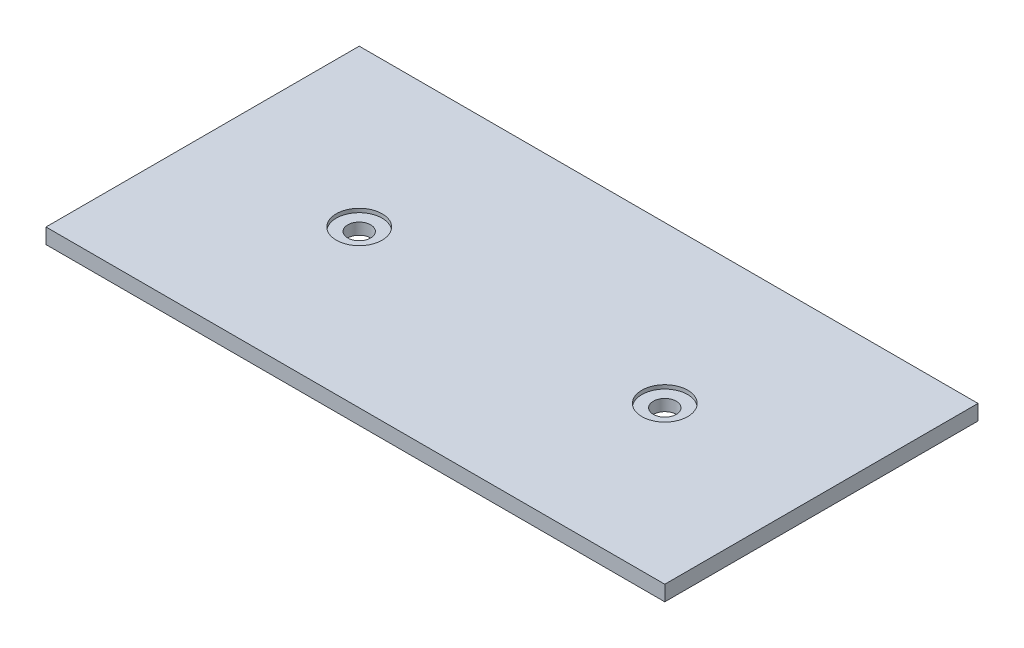
ISO-10303-21;
HEADER;
FILE_DESCRIPTION(('STEP AP214'),'2;1');
FILE_NAME('part.step','',(''),(''),'','','');
FILE_SCHEMA(('AUTOMOTIVE_DESIGN { 1 0 10303 214 1 1 1 1 }'));
ENDSEC;
DATA;
#1=APPLICATION_CONTEXT('core data for automotive mechanical design processes');
#2=APPLICATION_PROTOCOL_DEFINITION('international standard','automotive_design',2000,#1);
#3=PRODUCT_CONTEXT('',#1,'mechanical');
#4=PRODUCT('Part','Part','',(#3));
#5=PRODUCT_RELATED_PRODUCT_CATEGORY('part','',(#4));
#6=PRODUCT_DEFINITION_FORMATION('','',#4);
#7=PRODUCT_DEFINITION_CONTEXT('part definition',#1,'design');
#8=PRODUCT_DEFINITION('design','',#6,#7);
#9=PRODUCT_DEFINITION_SHAPE('','',#8);
#10=(LENGTH_UNIT() NAMED_UNIT(*) SI_UNIT(.MILLI.,.METRE.));
#11=(NAMED_UNIT(*) PLANE_ANGLE_UNIT() SI_UNIT($,.RADIAN.));
#12=(NAMED_UNIT(*) SI_UNIT($,.STERADIAN.) SOLID_ANGLE_UNIT());
#13=UNCERTAINTY_MEASURE_WITH_UNIT(LENGTH_MEASURE(1.E-05),#10,'distance_accuracy_value','');
#14=(GEOMETRIC_REPRESENTATION_CONTEXT(3) GLOBAL_UNCERTAINTY_ASSIGNED_CONTEXT((#13)) GLOBAL_UNIT_ASSIGNED_CONTEXT((#10,
#11,#12)) REPRESENTATION_CONTEXT('',''));
#15=CARTESIAN_POINT('',(0.,0.,0.));
#16=DIRECTION('',(0.,0.,1.));
#17=DIRECTION('',(1.,0.,0.));
#18=AXIS2_PLACEMENT_3D('',#15,#16,#17);
#19=CARTESIAN_POINT('',(0.,2.,0.));
#20=DIRECTION('',(1.,0.,0.));
#21=DIRECTION('',(0.,0.,-1.));
#22=AXIS2_PLACEMENT_3D('',#19,#20,#21);
#23=PLANE('',#22);
#24=DIRECTION('',(0.,0.,1.));
#25=VECTOR('',#24,1.);
#26=CARTESIAN_POINT('',(0.,0.,0.));
#27=LINE('',#26,#25);
#28=CARTESIAN_POINT('',(0.,0.,-41.));
#29=VERTEX_POINT('',#28);
#30=CARTESIAN_POINT('',(0.,0.,0.));
#31=VERTEX_POINT('',#30);
#32=EDGE_CURVE('E96',#29,#31,#27,.T.);
#33=ORIENTED_EDGE('',*,*,#32,.T.);
#34=DIRECTION('',(0.,-1.,0.));
#35=VECTOR('',#34,1.);
#36=CARTESIAN_POINT('',(0.,2.,0.));
#37=LINE('',#36,#35);
#38=CARTESIAN_POINT('',(0.,2.,0.));
#39=VERTEX_POINT('',#38);
#40=EDGE_CURVE('E11',#39,#31,#37,.T.);
#41=ORIENTED_EDGE('',*,*,#40,.F.);
#42=DIRECTION('',(0.,0.,1.));
#43=VECTOR('',#42,1.);
#44=CARTESIAN_POINT('',(0.,2.,0.));
#45=LINE('',#44,#43);
#46=CARTESIAN_POINT('',(0.,2.,-41.));
#47=VERTEX_POINT('',#46);
#48=EDGE_CURVE('E84',#47,#39,#45,.T.);
#49=ORIENTED_EDGE('',*,*,#48,.F.);
#50=DIRECTION('',(0.,-1.,0.));
#51=VECTOR('',#50,1.);
#52=CARTESIAN_POINT('',(0.,2.,-41.));
#53=LINE('',#52,#51);
#54=EDGE_CURVE('E92',#47,#29,#53,.T.);
#55=ORIENTED_EDGE('',*,*,#54,.T.);
#56=EDGE_LOOP('',(#33,#41,#49,#55));
#57=FACE_BOUND('',#56,.T.);
#58=ADVANCED_FACE('F33',(#57),#23,.F.);
#59=CARTESIAN_POINT('',(0.,2.,0.));
#60=DIRECTION('',(0.,0.,-1.));
#61=DIRECTION('',(-1.,0.,0.));
#62=AXIS2_PLACEMENT_3D('',#59,#60,#61);
#63=PLANE('',#62);
#64=DIRECTION('',(1.,0.,0.));
#65=VECTOR('',#64,1.);
#66=CARTESIAN_POINT('',(0.,0.,0.));
#67=LINE('',#66,#65);
#68=CARTESIAN_POINT('',(81.,0.,0.));
#69=VERTEX_POINT('',#68);
#70=EDGE_CURVE('E88',#31,#69,#67,.T.);
#71=ORIENTED_EDGE('',*,*,#70,.T.);
#72=DIRECTION('',(0.,-1.,0.));
#73=VECTOR('',#72,1.);
#74=CARTESIAN_POINT('',(81.,2.,0.));
#75=LINE('',#74,#73);
#76=CARTESIAN_POINT('',(81.,2.,0.));
#77=VERTEX_POINT('',#76);
#78=EDGE_CURVE('E41',#77,#69,#75,.T.);
#79=ORIENTED_EDGE('',*,*,#78,.F.);
#80=DIRECTION('',(1.,0.,0.));
#81=VECTOR('',#80,1.);
#82=CARTESIAN_POINT('',(0.,2.,0.));
#83=LINE('',#82,#81);
#84=EDGE_CURVE('E79',#39,#77,#83,.T.);
#85=ORIENTED_EDGE('',*,*,#84,.F.);
#86=ORIENTED_EDGE('',*,*,#40,.T.);
#87=EDGE_LOOP('',(#71,#79,#85,#86));
#88=FACE_BOUND('',#87,.T.);
#89=ADVANCED_FACE('F87',(#88),#63,.F.);
#90=CARTESIAN_POINT('',(81.,2.,0.));
#91=DIRECTION('',(-1.,0.,0.));
#92=DIRECTION('',(0.,0.,1.));
#93=AXIS2_PLACEMENT_3D('',#90,#91,#92);
#94=PLANE('',#93);
#95=DIRECTION('',(0.,0.,-1.));
#96=VECTOR('',#95,1.);
#97=CARTESIAN_POINT('',(81.,0.,0.));
#98=LINE('',#97,#96);
#99=CARTESIAN_POINT('',(81.,0.,-41.));
#100=VERTEX_POINT('',#99);
#101=EDGE_CURVE('E66',#69,#100,#98,.T.);
#102=ORIENTED_EDGE('',*,*,#101,.T.);
#103=DIRECTION('',(0.,-1.,0.));
#104=VECTOR('',#103,1.);
#105=CARTESIAN_POINT('',(81.,2.,-41.));
#106=LINE('',#105,#104);
#107=CARTESIAN_POINT('',(81.,2.,-41.));
#108=VERTEX_POINT('',#107);
#109=EDGE_CURVE('E89',#108,#100,#106,.T.);
#110=ORIENTED_EDGE('',*,*,#109,.F.);
#111=DIRECTION('',(0.,0.,-1.));
#112=VECTOR('',#111,1.);
#113=CARTESIAN_POINT('',(81.,2.,0.));
#114=LINE('',#113,#112);
#115=EDGE_CURVE('E82',#77,#108,#114,.T.);
#116=ORIENTED_EDGE('',*,*,#115,.F.);
#117=ORIENTED_EDGE('',*,*,#78,.T.);
#118=EDGE_LOOP('',(#102,#110,#116,#117));
#119=FACE_BOUND('',#118,.T.);
#120=ADVANCED_FACE('F90',(#119),#94,.F.);
#121=CARTESIAN_POINT('',(0.,2.,-41.));
#122=DIRECTION('',(0.,0.,1.));
#123=DIRECTION('',(1.,0.,0.));
#124=AXIS2_PLACEMENT_3D('',#121,#122,#123);
#125=PLANE('',#124);
#126=DIRECTION('',(-1.,0.,0.));
#127=VECTOR('',#126,1.);
#128=CARTESIAN_POINT('',(0.,0.,-41.));
#129=LINE('',#128,#127);
#130=EDGE_CURVE('E72',#100,#29,#129,.T.);
#131=ORIENTED_EDGE('',*,*,#130,.T.);
#132=ORIENTED_EDGE('',*,*,#54,.F.);
#133=DIRECTION('',(-1.,0.,0.));
#134=VECTOR('',#133,1.);
#135=CARTESIAN_POINT('',(0.,2.,-41.));
#136=LINE('',#135,#134);
#137=EDGE_CURVE('E49',#108,#47,#136,.T.);
#138=ORIENTED_EDGE('',*,*,#137,.F.);
#139=ORIENTED_EDGE('',*,*,#109,.T.);
#140=EDGE_LOOP('',(#131,#132,#138,#139));
#141=FACE_BOUND('',#140,.T.);
#142=ADVANCED_FACE('F104',(#141),#125,.F.);
#143=CARTESIAN_POINT('',(0.,2.,0.));
#144=DIRECTION('',(0.,-1.,0.));
#145=DIRECTION('',(0.,0.,-1.));
#146=AXIS2_PLACEMENT_3D('',#143,#144,#145);
#147=PLANE('',#146);
#148=CARTESIAN_POINT('',(20.5,2.,-20.5));
#149=DIRECTION('',(0.,1.,0.));
#150=DIRECTION('',(0.,0.,1.));
#151=AXIS2_PLACEMENT_3D('',#148,#149,#150);
#152=CIRCLE('',#151,3.);
#153=CARTESIAN_POINT('',(20.5,2.,-17.5));
#154=VERTEX_POINT('',#153);
#155=EDGE_CURVE('E117',#154,#154,#152,.T.);
#156=ORIENTED_EDGE('',*,*,#155,.F.);
#157=EDGE_LOOP('',(#156));
#158=FACE_BOUND('',#157,.T.);
#159=CARTESIAN_POINT('',(60.5,2.,-20.5));
#160=DIRECTION('',(0.,1.,0.));
#161=DIRECTION('',(0.,0.,1.));
#162=AXIS2_PLACEMENT_3D('',#159,#160,#161);
#163=CIRCLE('',#162,3.00000000000001);
#164=CARTESIAN_POINT('',(60.5,2.,-17.5));
#165=VERTEX_POINT('',#164);
#166=EDGE_CURVE('E110',#165,#165,#163,.T.);
#167=ORIENTED_EDGE('',*,*,#166,.F.);
#168=EDGE_LOOP('',(#167));
#169=FACE_BOUND('',#168,.T.);
#170=ORIENTED_EDGE('',*,*,#48,.T.);
#171=ORIENTED_EDGE('',*,*,#84,.T.);
#172=ORIENTED_EDGE('',*,*,#115,.T.);
#173=ORIENTED_EDGE('',*,*,#137,.T.);
#174=EDGE_LOOP('',(#170,#171,#172,#173));
#175=FACE_BOUND('',#174,.T.);
#176=ADVANCED_FACE('F80',(#158,#169,#175),#147,.F.);
#177=CARTESIAN_POINT('',(0.,0.,0.));
#178=DIRECTION('',(0.,-1.,0.));
#179=DIRECTION('',(0.,0.,-1.));
#180=AXIS2_PLACEMENT_3D('',#177,#178,#179);
#181=PLANE('',#180);
#182=CARTESIAN_POINT('',(70.4999999999999,0.,-10.5));
#183=DIRECTION('',(0.,-1.,0.));
#184=DIRECTION('',(0.,0.,-1.));
#185=AXIS2_PLACEMENT_3D('',#182,#183,#184);
#186=CIRCLE('',#185,3.00000000000001);
#187=CARTESIAN_POINT('',(70.4999999999999,0.,-13.5));
#188=VERTEX_POINT('',#187);
#189=EDGE_CURVE('E176',#188,#188,#186,.T.);
#190=ORIENTED_EDGE('',*,*,#189,.F.);
#191=EDGE_LOOP('',(#190));
#192=FACE_BOUND('',#191,.T.);
#193=CARTESIAN_POINT('',(10.4999999999999,0.,-10.5000000000004));
#194=DIRECTION('',(0.,-1.,0.));
#195=DIRECTION('',(0.,0.,-1.));
#196=AXIS2_PLACEMENT_3D('',#193,#194,#195);
#197=CIRCLE('',#196,3.00000000000001);
#198=CARTESIAN_POINT('',(10.4999999999999,0.,-13.5000000000004));
#199=VERTEX_POINT('',#198);
#200=EDGE_CURVE('E170',#199,#199,#197,.T.);
#201=ORIENTED_EDGE('',*,*,#200,.F.);
#202=EDGE_LOOP('',(#201));
#203=FACE_BOUND('',#202,.T.);
#204=CARTESIAN_POINT('',(30.4999999999999,0.,-10.5000000000003));
#205=DIRECTION('',(0.,-1.,0.));
#206=DIRECTION('',(0.,0.,-1.));
#207=AXIS2_PLACEMENT_3D('',#204,#205,#206);
#208=CIRCLE('',#207,3.00000000000001);
#209=CARTESIAN_POINT('',(30.4999999999999,0.,-13.5000000000003));
#210=VERTEX_POINT('',#209);
#211=EDGE_CURVE('E164',#210,#210,#208,.T.);
#212=ORIENTED_EDGE('',*,*,#211,.F.);
#213=EDGE_LOOP('',(#212));
#214=FACE_BOUND('',#213,.T.);
#215=CARTESIAN_POINT('',(50.4999999999999,0.,-10.5000000000001));
#216=DIRECTION('',(0.,-1.,0.));
#217=DIRECTION('',(0.,0.,-1.));
#218=AXIS2_PLACEMENT_3D('',#215,#216,#217);
#219=CIRCLE('',#218,3.00000000000001);
#220=CARTESIAN_POINT('',(50.4999999999999,0.,-13.5000000000001));
#221=VERTEX_POINT('',#220);
#222=EDGE_CURVE('E158',#221,#221,#219,.T.);
#223=ORIENTED_EDGE('',*,*,#222,.F.);
#224=EDGE_LOOP('',(#223));
#225=FACE_BOUND('',#224,.T.);
#226=CARTESIAN_POINT('',(10.5,0.,-30.5000000000004));
#227=DIRECTION('',(0.,-1.,0.));
#228=DIRECTION('',(0.,0.,-1.));
#229=AXIS2_PLACEMENT_3D('',#226,#227,#228);
#230=CIRCLE('',#229,3.00000000000001);
#231=CARTESIAN_POINT('',(10.5,0.,-33.5000000000004));
#232=VERTEX_POINT('',#231);
#233=EDGE_CURVE('E152',#232,#232,#230,.T.);
#234=ORIENTED_EDGE('',*,*,#233,.F.);
#235=EDGE_LOOP('',(#234));
#236=FACE_BOUND('',#235,.T.);
#237=CARTESIAN_POINT('',(30.5,0.,-30.5000000000003));
#238=DIRECTION('',(0.,-1.,0.));
#239=DIRECTION('',(0.,0.,-1.));
#240=AXIS2_PLACEMENT_3D('',#237,#238,#239);
#241=CIRCLE('',#240,3.00000000000001);
#242=CARTESIAN_POINT('',(30.5,0.,-33.5000000000003));
#243=VERTEX_POINT('',#242);
#244=EDGE_CURVE('E146',#243,#243,#241,.T.);
#245=ORIENTED_EDGE('',*,*,#244,.F.);
#246=EDGE_LOOP('',(#245));
#247=FACE_BOUND('',#246,.T.);
#248=CARTESIAN_POINT('',(50.5,0.,-30.5000000000001));
#249=DIRECTION('',(0.,-1.,0.));
#250=DIRECTION('',(0.,0.,-1.));
#251=AXIS2_PLACEMENT_3D('',#248,#249,#250);
#252=CIRCLE('',#251,3.00000000000001);
#253=CARTESIAN_POINT('',(50.5,0.,-33.5000000000001));
#254=VERTEX_POINT('',#253);
#255=EDGE_CURVE('E140',#254,#254,#252,.T.);
#256=ORIENTED_EDGE('',*,*,#255,.F.);
#257=EDGE_LOOP('',(#256));
#258=FACE_BOUND('',#257,.T.);
#259=CARTESIAN_POINT('',(70.5,0.,-30.5));
#260=DIRECTION('',(0.,-1.,0.));
#261=DIRECTION('',(0.,0.,-1.));
#262=AXIS2_PLACEMENT_3D('',#259,#260,#261);
#263=CIRCLE('',#262,3.00000000000001);
#264=CARTESIAN_POINT('',(70.5,0.,-33.5));
#265=VERTEX_POINT('',#264);
#266=EDGE_CURVE('E134',#265,#265,#263,.T.);
#267=ORIENTED_EDGE('',*,*,#266,.F.);
#268=EDGE_LOOP('',(#267));
#269=FACE_BOUND('',#268,.T.);
#270=CARTESIAN_POINT('',(20.5,0.,-20.5));
#271=DIRECTION('',(0.,1.,0.));
#272=DIRECTION('',(0.,0.,1.));
#273=AXIS2_PLACEMENT_3D('',#270,#271,#272);
#274=CIRCLE('',#273,1.5);
#275=CARTESIAN_POINT('',(20.5,0.,-19.));
#276=VERTEX_POINT('',#275);
#277=EDGE_CURVE('E114',#276,#276,#274,.T.);
#278=ORIENTED_EDGE('',*,*,#277,.T.);
#279=EDGE_LOOP('',(#278));
#280=FACE_BOUND('',#279,.T.);
#281=CARTESIAN_POINT('',(60.5,0.,-20.5));
#282=DIRECTION('',(0.,1.,0.));
#283=DIRECTION('',(0.,0.,1.));
#284=AXIS2_PLACEMENT_3D('',#281,#282,#283);
#285=CIRCLE('',#284,1.5);
#286=CARTESIAN_POINT('',(60.5,0.,-19.));
#287=VERTEX_POINT('',#286);
#288=EDGE_CURVE('E125',#287,#287,#285,.T.);
#289=ORIENTED_EDGE('',*,*,#288,.T.);
#290=EDGE_LOOP('',(#289));
#291=FACE_BOUND('',#290,.T.);
#292=ORIENTED_EDGE('',*,*,#32,.F.);
#293=ORIENTED_EDGE('',*,*,#130,.F.);
#294=ORIENTED_EDGE('',*,*,#101,.F.);
#295=ORIENTED_EDGE('',*,*,#70,.F.);
#296=EDGE_LOOP('',(#292,#293,#294,#295));
#297=FACE_BOUND('',#296,.T.);
#298=ADVANCED_FACE('F107',(#192,#203,#214,#225,#236,#247,#258,#269,#280,#291,#297),#181,.T.);
#299=CARTESIAN_POINT('',(60.5,1.5,-20.5));
#300=DIRECTION('',(0.,1.,0.));
#301=DIRECTION('',(0.,0.,1.));
#302=AXIS2_PLACEMENT_3D('',#299,#300,#301);
#303=CYLINDRICAL_SURFACE('',#302,3.00000000000001);
#304=CARTESIAN_POINT('',(60.5,1.5,-20.5));
#305=DIRECTION('',(0.,1.,0.));
#306=DIRECTION('',(0.,0.,1.));
#307=AXIS2_PLACEMENT_3D('',#304,#305,#306);
#308=CIRCLE('',#307,3.00000000000001);
#309=CARTESIAN_POINT('',(60.5,1.5,-17.5));
#310=VERTEX_POINT('',#309);
#311=EDGE_CURVE('E113',#310,#310,#308,.T.);
#312=ORIENTED_EDGE('',*,*,#311,.F.);
#313=EDGE_LOOP('',(#312));
#314=FACE_BOUND('',#313,.T.);
#315=ORIENTED_EDGE('',*,*,#166,.T.);
#316=EDGE_LOOP('',(#315));
#317=FACE_BOUND('',#316,.T.);
#318=ADVANCED_FACE('F193',(#314,#317),#303,.F.);
#319=CARTESIAN_POINT('',(60.5,1.5,-20.5));
#320=DIRECTION('',(0.,1.,0.));
#321=DIRECTION('',(0.,0.,1.));
#322=AXIS2_PLACEMENT_3D('',#319,#320,#321);
#323=PLANE('',#322);
#324=CARTESIAN_POINT('',(60.5,1.5,-20.5));
#325=DIRECTION('',(0.,1.,0.));
#326=DIRECTION('',(0.,0.,1.));
#327=AXIS2_PLACEMENT_3D('',#324,#325,#326);
#328=CIRCLE('',#327,1.5);
#329=CARTESIAN_POINT('',(60.5,1.5,-19.));
#330=VERTEX_POINT('',#329);
#331=EDGE_CURVE('E122',#330,#330,#328,.T.);
#332=ORIENTED_EDGE('',*,*,#331,.F.);
#333=EDGE_LOOP('',(#332));
#334=FACE_BOUND('',#333,.T.);
#335=ORIENTED_EDGE('',*,*,#311,.T.);
#336=EDGE_LOOP('',(#335));
#337=FACE_BOUND('',#336,.T.);
#338=ADVANCED_FACE('F221',(#334,#337),#323,.T.);
#339=CARTESIAN_POINT('',(20.5,1.5,-20.5));
#340=DIRECTION('',(0.,1.,0.));
#341=DIRECTION('',(0.,0.,1.));
#342=AXIS2_PLACEMENT_3D('',#339,#340,#341);
#343=CYLINDRICAL_SURFACE('',#342,3.);
#344=CARTESIAN_POINT('',(20.5,1.5,-20.5));
#345=DIRECTION('',(0.,1.,0.));
#346=DIRECTION('',(0.,0.,1.));
#347=AXIS2_PLACEMENT_3D('',#344,#345,#346);
#348=CIRCLE('',#347,3.);
#349=CARTESIAN_POINT('',(20.5,1.5,-17.5));
#350=VERTEX_POINT('',#349);
#351=EDGE_CURVE('E99',#350,#350,#348,.T.);
#352=ORIENTED_EDGE('',*,*,#351,.F.);
#353=EDGE_LOOP('',(#352));
#354=FACE_BOUND('',#353,.T.);
#355=ORIENTED_EDGE('',*,*,#155,.T.);
#356=EDGE_LOOP('',(#355));
#357=FACE_BOUND('',#356,.T.);
#358=ADVANCED_FACE('F224',(#354,#357),#343,.F.);
#359=CARTESIAN_POINT('',(20.5,1.5,-20.5));
#360=DIRECTION('',(0.,1.,0.));
#361=DIRECTION('',(0.,0.,1.));
#362=AXIS2_PLACEMENT_3D('',#359,#360,#361);
#363=PLANE('',#362);
#364=CARTESIAN_POINT('',(20.5,1.5,-20.5));
#365=DIRECTION('',(0.,1.,0.));
#366=DIRECTION('',(0.,0.,1.));
#367=AXIS2_PLACEMENT_3D('',#364,#365,#366);
#368=CIRCLE('',#367,1.5);
#369=CARTESIAN_POINT('',(20.5,1.5,-19.));
#370=VERTEX_POINT('',#369);
#371=EDGE_CURVE('E129',#370,#370,#368,.T.);
#372=ORIENTED_EDGE('',*,*,#371,.F.);
#373=EDGE_LOOP('',(#372));
#374=FACE_BOUND('',#373,.T.);
#375=ORIENTED_EDGE('',*,*,#351,.T.);
#376=EDGE_LOOP('',(#375));
#377=FACE_BOUND('',#376,.T.);
#378=ADVANCED_FACE('F217',(#374,#377),#363,.T.);
#379=CARTESIAN_POINT('',(60.5,0.,-20.5));
#380=DIRECTION('',(0.,1.,0.));
#381=DIRECTION('',(0.,0.,1.));
#382=AXIS2_PLACEMENT_3D('',#379,#380,#381);
#383=CYLINDRICAL_SURFACE('',#382,1.5);
#384=ORIENTED_EDGE('',*,*,#288,.F.);
#385=EDGE_LOOP('',(#384));
#386=FACE_BOUND('',#385,.T.);
#387=ORIENTED_EDGE('',*,*,#331,.T.);
#388=EDGE_LOOP('',(#387));
#389=FACE_BOUND('',#388,.T.);
#390=ADVANCED_FACE('F213',(#386,#389),#383,.F.);
#391=CARTESIAN_POINT('',(20.5,0.,-20.5));
#392=DIRECTION('',(0.,1.,0.));
#393=DIRECTION('',(0.,0.,1.));
#394=AXIS2_PLACEMENT_3D('',#391,#392,#393);
#395=CYLINDRICAL_SURFACE('',#394,1.5);
#396=ORIENTED_EDGE('',*,*,#277,.F.);
#397=EDGE_LOOP('',(#396));
#398=FACE_BOUND('',#397,.T.);
#399=ORIENTED_EDGE('',*,*,#371,.T.);
#400=EDGE_LOOP('',(#399));
#401=FACE_BOUND('',#400,.T.);
#402=ADVANCED_FACE('F216',(#398,#401),#395,.F.);
#403=CARTESIAN_POINT('',(70.5,-2.,-30.5));
#404=DIRECTION('',(0.,1.,0.));
#405=DIRECTION('',(0.,0.,1.));
#406=AXIS2_PLACEMENT_3D('',#403,#404,#405);
#407=CYLINDRICAL_SURFACE('',#406,3.00000000000001);
#408=CARTESIAN_POINT('',(70.5,-2.,-30.5));
#409=DIRECTION('',(0.,-1.,0.));
#410=DIRECTION('',(0.,0.,-1.));
#411=AXIS2_PLACEMENT_3D('',#408,#409,#410);
#412=CIRCLE('',#411,3.00000000000001);
#413=CARTESIAN_POINT('',(70.5,-2.,-33.5));
#414=VERTEX_POINT('',#413);
#415=EDGE_CURVE('E126',#414,#414,#412,.T.);
#416=ORIENTED_EDGE('',*,*,#415,.F.);
#417=EDGE_LOOP('',(#416));
#418=FACE_BOUND('',#417,.T.);
#419=ORIENTED_EDGE('',*,*,#266,.T.);
#420=EDGE_LOOP('',(#419));
#421=FACE_BOUND('',#420,.T.);
#422=ADVANCED_FACE('F305',(#418,#421),#407,.T.);
#423=CARTESIAN_POINT('',(70.5,-2.,-30.5));
#424=DIRECTION('',(0.,-1.,0.));
#425=DIRECTION('',(0.,0.,-1.));
#426=AXIS2_PLACEMENT_3D('',#423,#424,#425);
#427=PLANE('',#426);
#428=ORIENTED_EDGE('',*,*,#415,.T.);
#429=EDGE_LOOP('',(#428));
#430=FACE_BOUND('',#429,.T.);
#431=ADVANCED_FACE('F320',(#430),#427,.T.);
#432=CARTESIAN_POINT('',(50.5,-2.,-30.5000000000001));
#433=DIRECTION('',(0.,1.,0.));
#434=DIRECTION('',(0.,0.,1.));
#435=AXIS2_PLACEMENT_3D('',#432,#433,#434);
#436=CYLINDRICAL_SURFACE('',#435,3.00000000000001);
#437=CARTESIAN_POINT('',(50.5,-2.,-30.5000000000001));
#438=DIRECTION('',(0.,-1.,0.));
#439=DIRECTION('',(0.,0.,-1.));
#440=AXIS2_PLACEMENT_3D('',#437,#438,#439);
#441=CIRCLE('',#440,3.00000000000001);
#442=CARTESIAN_POINT('',(50.5,-2.,-33.5000000000001));
#443=VERTEX_POINT('',#442);
#444=EDGE_CURVE('E137',#443,#443,#441,.T.);
#445=ORIENTED_EDGE('',*,*,#444,.F.);
#446=EDGE_LOOP('',(#445));
#447=FACE_BOUND('',#446,.T.);
#448=ORIENTED_EDGE('',*,*,#255,.T.);
#449=EDGE_LOOP('',(#448));
#450=FACE_BOUND('',#449,.T.);
#451=ADVANCED_FACE('F330',(#447,#450),#436,.T.);
#452=CARTESIAN_POINT('',(50.5,-2.,-30.5000000000001));
#453=DIRECTION('',(0.,-1.,0.));
#454=DIRECTION('',(0.,0.,-1.));
#455=AXIS2_PLACEMENT_3D('',#452,#453,#454);
#456=PLANE('',#455);
#457=ORIENTED_EDGE('',*,*,#444,.T.);
#458=EDGE_LOOP('',(#457));
#459=FACE_BOUND('',#458,.T.);
#460=ADVANCED_FACE('F340',(#459),#456,.T.);
#461=CARTESIAN_POINT('',(30.5,-2.,-30.5000000000003));
#462=DIRECTION('',(0.,1.,0.));
#463=DIRECTION('',(0.,0.,1.));
#464=AXIS2_PLACEMENT_3D('',#461,#462,#463);
#465=CYLINDRICAL_SURFACE('',#464,3.00000000000001);
#466=CARTESIAN_POINT('',(30.5,-2.,-30.5000000000003));
#467=DIRECTION('',(0.,-1.,0.));
#468=DIRECTION('',(0.,0.,-1.));
#469=AXIS2_PLACEMENT_3D('',#466,#467,#468);
#470=CIRCLE('',#469,3.00000000000001);
#471=CARTESIAN_POINT('',(30.5,-2.,-33.5000000000003));
#472=VERTEX_POINT('',#471);
#473=EDGE_CURVE('E143',#472,#472,#470,.T.);
#474=ORIENTED_EDGE('',*,*,#473,.F.);
#475=EDGE_LOOP('',(#474));
#476=FACE_BOUND('',#475,.T.);
#477=ORIENTED_EDGE('',*,*,#244,.T.);
#478=EDGE_LOOP('',(#477));
#479=FACE_BOUND('',#478,.T.);
#480=ADVANCED_FACE('F350',(#476,#479),#465,.T.);
#481=CARTESIAN_POINT('',(30.5,-2.,-30.5000000000003));
#482=DIRECTION('',(0.,-1.,0.));
#483=DIRECTION('',(0.,0.,-1.));
#484=AXIS2_PLACEMENT_3D('',#481,#482,#483);
#485=PLANE('',#484);
#486=ORIENTED_EDGE('',*,*,#473,.T.);
#487=EDGE_LOOP('',(#486));
#488=FACE_BOUND('',#487,.T.);
#489=ADVANCED_FACE('F360',(#488),#485,.T.);
#490=CARTESIAN_POINT('',(10.5,-2.,-30.5000000000004));
#491=DIRECTION('',(0.,1.,0.));
#492=DIRECTION('',(0.,0.,1.));
#493=AXIS2_PLACEMENT_3D('',#490,#491,#492);
#494=CYLINDRICAL_SURFACE('',#493,3.00000000000001);
#495=CARTESIAN_POINT('',(10.5,-2.,-30.5000000000004));
#496=DIRECTION('',(0.,-1.,0.));
#497=DIRECTION('',(0.,0.,-1.));
#498=AXIS2_PLACEMENT_3D('',#495,#496,#497);
#499=CIRCLE('',#498,3.00000000000001);
#500=CARTESIAN_POINT('',(10.5,-2.,-33.5000000000004));
#501=VERTEX_POINT('',#500);
#502=EDGE_CURVE('E149',#501,#501,#499,.T.);
#503=ORIENTED_EDGE('',*,*,#502,.F.);
#504=EDGE_LOOP('',(#503));
#505=FACE_BOUND('',#504,.T.);
#506=ORIENTED_EDGE('',*,*,#233,.T.);
#507=EDGE_LOOP('',(#506));
#508=FACE_BOUND('',#507,.T.);
#509=ADVANCED_FACE('F370',(#505,#508),#494,.T.);
#510=CARTESIAN_POINT('',(10.5,-2.,-30.5000000000004));
#511=DIRECTION('',(0.,-1.,0.));
#512=DIRECTION('',(0.,0.,-1.));
#513=AXIS2_PLACEMENT_3D('',#510,#511,#512);
#514=PLANE('',#513);
#515=ORIENTED_EDGE('',*,*,#502,.T.);
#516=EDGE_LOOP('',(#515));
#517=FACE_BOUND('',#516,.T.);
#518=ADVANCED_FACE('F380',(#517),#514,.T.);
#519=CARTESIAN_POINT('',(50.4999999999999,-2.,-10.5000000000001));
#520=DIRECTION('',(0.,1.,0.));
#521=DIRECTION('',(0.,0.,1.));
#522=AXIS2_PLACEMENT_3D('',#519,#520,#521);
#523=CYLINDRICAL_SURFACE('',#522,3.00000000000001);
#524=CARTESIAN_POINT('',(50.4999999999999,-2.,-10.5000000000001));
#525=DIRECTION('',(0.,-1.,0.));
#526=DIRECTION('',(0.,0.,-1.));
#527=AXIS2_PLACEMENT_3D('',#524,#525,#526);
#528=CIRCLE('',#527,3.00000000000001);
#529=CARTESIAN_POINT('',(50.4999999999999,-2.,-13.5000000000001));
#530=VERTEX_POINT('',#529);
#531=EDGE_CURVE('E155',#530,#530,#528,.T.);
#532=ORIENTED_EDGE('',*,*,#531,.F.);
#533=EDGE_LOOP('',(#532));
#534=FACE_BOUND('',#533,.T.);
#535=ORIENTED_EDGE('',*,*,#222,.T.);
#536=EDGE_LOOP('',(#535));
#537=FACE_BOUND('',#536,.T.);
#538=ADVANCED_FACE('F390',(#534,#537),#523,.T.);
#539=CARTESIAN_POINT('',(50.4999999999999,-2.,-10.5000000000001));
#540=DIRECTION('',(0.,-1.,0.));
#541=DIRECTION('',(0.,0.,-1.));
#542=AXIS2_PLACEMENT_3D('',#539,#540,#541);
#543=PLANE('',#542);
#544=ORIENTED_EDGE('',*,*,#531,.T.);
#545=EDGE_LOOP('',(#544));
#546=FACE_BOUND('',#545,.T.);
#547=ADVANCED_FACE('F400',(#546),#543,.T.);
#548=CARTESIAN_POINT('',(30.4999999999999,-2.,-10.5000000000003));
#549=DIRECTION('',(0.,1.,0.));
#550=DIRECTION('',(0.,0.,1.));
#551=AXIS2_PLACEMENT_3D('',#548,#549,#550);
#552=CYLINDRICAL_SURFACE('',#551,3.00000000000001);
#553=CARTESIAN_POINT('',(30.4999999999999,-2.,-10.5000000000003));
#554=DIRECTION('',(0.,-1.,0.));
#555=DIRECTION('',(0.,0.,-1.));
#556=AXIS2_PLACEMENT_3D('',#553,#554,#555);
#557=CIRCLE('',#556,3.00000000000001);
#558=CARTESIAN_POINT('',(30.4999999999999,-2.,-13.5000000000003));
#559=VERTEX_POINT('',#558);
#560=EDGE_CURVE('E161',#559,#559,#557,.T.);
#561=ORIENTED_EDGE('',*,*,#560,.F.);
#562=EDGE_LOOP('',(#561));
#563=FACE_BOUND('',#562,.T.);
#564=ORIENTED_EDGE('',*,*,#211,.T.);
#565=EDGE_LOOP('',(#564));
#566=FACE_BOUND('',#565,.T.);
#567=ADVANCED_FACE('F410',(#563,#566),#552,.T.);
#568=CARTESIAN_POINT('',(30.4999999999999,-2.,-10.5000000000003));
#569=DIRECTION('',(0.,-1.,0.));
#570=DIRECTION('',(0.,0.,-1.));
#571=AXIS2_PLACEMENT_3D('',#568,#569,#570);
#572=PLANE('',#571);
#573=ORIENTED_EDGE('',*,*,#560,.T.);
#574=EDGE_LOOP('',(#573));
#575=FACE_BOUND('',#574,.T.);
#576=ADVANCED_FACE('F420',(#575),#572,.T.);
#577=CARTESIAN_POINT('',(10.4999999999999,-2.,-10.5000000000004));
#578=DIRECTION('',(0.,1.,0.));
#579=DIRECTION('',(0.,0.,1.));
#580=AXIS2_PLACEMENT_3D('',#577,#578,#579);
#581=CYLINDRICAL_SURFACE('',#580,3.00000000000001);
#582=CARTESIAN_POINT('',(10.4999999999999,-2.,-10.5000000000004));
#583=DIRECTION('',(0.,-1.,0.));
#584=DIRECTION('',(0.,0.,-1.));
#585=AXIS2_PLACEMENT_3D('',#582,#583,#584);
#586=CIRCLE('',#585,3.00000000000001);
#587=CARTESIAN_POINT('',(10.4999999999999,-2.,-13.5000000000004));
#588=VERTEX_POINT('',#587);
#589=EDGE_CURVE('E167',#588,#588,#586,.T.);
#590=ORIENTED_EDGE('',*,*,#589,.F.);
#591=EDGE_LOOP('',(#590));
#592=FACE_BOUND('',#591,.T.);
#593=ORIENTED_EDGE('',*,*,#200,.T.);
#594=EDGE_LOOP('',(#593));
#595=FACE_BOUND('',#594,.T.);
#596=ADVANCED_FACE('F430',(#592,#595),#581,.T.);
#597=CARTESIAN_POINT('',(10.4999999999999,-2.,-10.5000000000004));
#598=DIRECTION('',(0.,-1.,0.));
#599=DIRECTION('',(0.,0.,-1.));
#600=AXIS2_PLACEMENT_3D('',#597,#598,#599);
#601=PLANE('',#600);
#602=ORIENTED_EDGE('',*,*,#589,.T.);
#603=EDGE_LOOP('',(#602));
#604=FACE_BOUND('',#603,.T.);
#605=ADVANCED_FACE('F187',(#604),#601,.T.);
#606=CARTESIAN_POINT('',(70.4999999999999,-2.,-10.5));
#607=DIRECTION('',(0.,1.,0.));
#608=DIRECTION('',(0.,0.,1.));
#609=AXIS2_PLACEMENT_3D('',#606,#607,#608);
#610=CYLINDRICAL_SURFACE('',#609,3.00000000000001);
#611=CARTESIAN_POINT('',(70.4999999999999,-2.,-10.5));
#612=DIRECTION('',(0.,-1.,0.));
#613=DIRECTION('',(0.,0.,-1.));
#614=AXIS2_PLACEMENT_3D('',#611,#612,#613);
#615=CIRCLE('',#614,3.00000000000001);
#616=CARTESIAN_POINT('',(70.4999999999999,-2.,-13.5));
#617=VERTEX_POINT('',#616);
#618=EDGE_CURVE('E173',#617,#617,#615,.T.);
#619=ORIENTED_EDGE('',*,*,#618,.F.);
#620=EDGE_LOOP('',(#619));
#621=FACE_BOUND('',#620,.T.);
#622=ORIENTED_EDGE('',*,*,#189,.T.);
#623=EDGE_LOOP('',(#622));
#624=FACE_BOUND('',#623,.T.);
#625=ADVANCED_FACE('F184',(#621,#624),#610,.T.);
#626=CARTESIAN_POINT('',(70.4999999999999,-2.,-10.5));
#627=DIRECTION('',(0.,-1.,0.));
#628=DIRECTION('',(0.,0.,-1.));
#629=AXIS2_PLACEMENT_3D('',#626,#627,#628);
#630=PLANE('',#629);
#631=ORIENTED_EDGE('',*,*,#618,.T.);
#632=EDGE_LOOP('',(#631));
#633=FACE_BOUND('',#632,.T.);
#634=ADVANCED_FACE('F182',(#633),#630,.T.);
#635=CLOSED_SHELL('',(#58,#89,#120,#142,#176,#298,#318,#338,#358,#378,#390,#402,#422,#431,#451,
#460,#480,#489,#509,#518,#538,#547,#567,#576,#596,#605,#625,#634));
#636=MANIFOLD_SOLID_BREP('B2',#635);
#637=ADVANCED_BREP_SHAPE_REPRESENTATION('',(#18,#636),#14);
#638=SHAPE_DEFINITION_REPRESENTATION(#9,#637);
ENDSEC;
END-ISO-10303-21;
